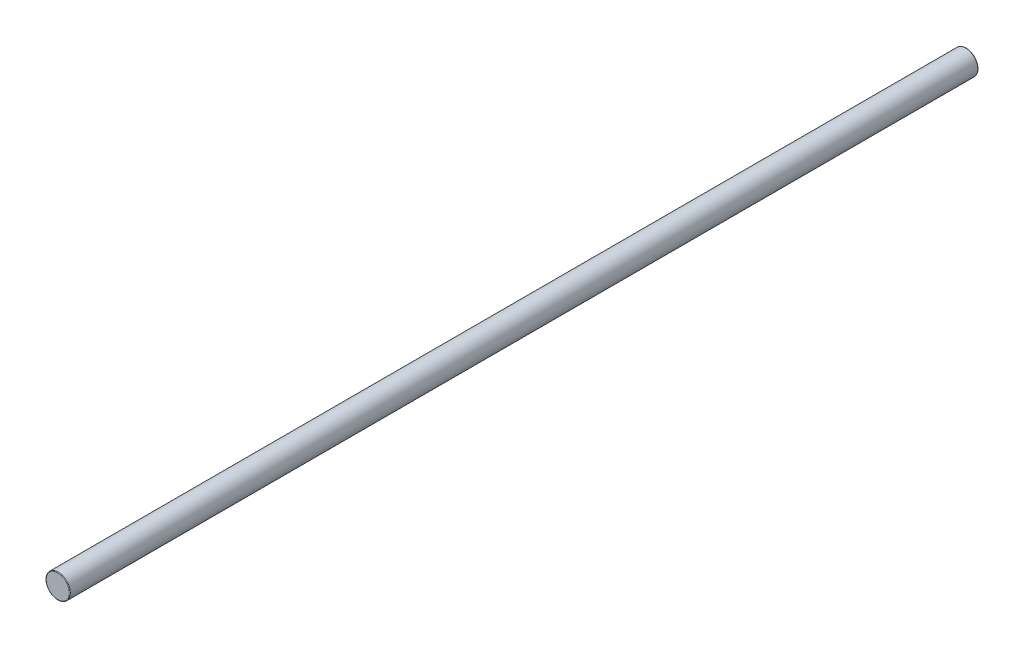
ISO-10303-21;
HEADER;
FILE_DESCRIPTION(('STEP AP214'),'2;1');
FILE_NAME('part.step','',(''),(''),'','','');
FILE_SCHEMA(('AUTOMOTIVE_DESIGN { 1 0 10303 214 1 1 1 1 }'));
ENDSEC;
DATA;
#1=APPLICATION_CONTEXT('core data for automotive mechanical design processes');
#2=APPLICATION_PROTOCOL_DEFINITION('international standard','automotive_design',2000,#1);
#3=PRODUCT_CONTEXT('',#1,'mechanical');
#4=PRODUCT('Part','Part','',(#3));
#5=PRODUCT_RELATED_PRODUCT_CATEGORY('part','',(#4));
#6=PRODUCT_DEFINITION_FORMATION('','',#4);
#7=PRODUCT_DEFINITION_CONTEXT('part definition',#1,'design');
#8=PRODUCT_DEFINITION('design','',#6,#7);
#9=PRODUCT_DEFINITION_SHAPE('','',#8);
#10=(LENGTH_UNIT() NAMED_UNIT(*) SI_UNIT(.MILLI.,.METRE.));
#11=(NAMED_UNIT(*) PLANE_ANGLE_UNIT() SI_UNIT($,.RADIAN.));
#12=(NAMED_UNIT(*) SI_UNIT($,.STERADIAN.) SOLID_ANGLE_UNIT());
#13=UNCERTAINTY_MEASURE_WITH_UNIT(LENGTH_MEASURE(1.E-05),#10,'distance_accuracy_value','');
#14=(GEOMETRIC_REPRESENTATION_CONTEXT(3) GLOBAL_UNCERTAINTY_ASSIGNED_CONTEXT((#13)) GLOBAL_UNIT_ASSIGNED_CONTEXT((#10,
#11,#12)) REPRESENTATION_CONTEXT('',''));
#15=CARTESIAN_POINT('',(0.,0.,0.));
#16=DIRECTION('',(0.,0.,1.));
#17=DIRECTION('',(1.,0.,0.));
#18=AXIS2_PLACEMENT_3D('',#15,#16,#17);
#19=CARTESIAN_POINT('',(0.,0.,-300.));
#20=DIRECTION('',(0.,0.,1.));
#21=DIRECTION('',(1.,0.,0.));
#22=AXIS2_PLACEMENT_3D('',#19,#20,#21);
#23=CYLINDRICAL_SURFACE('',#22,4.);
#24=CARTESIAN_POINT('',(0.,0.,-299.8));
#25=DIRECTION('',(0.,0.,1.));
#26=DIRECTION('',(1.,0.,0.));
#27=AXIS2_PLACEMENT_3D('',#24,#25,#26);
#28=CIRCLE('',#27,4.);
#29=CARTESIAN_POINT('',(4.,0.,-299.8));
#30=VERTEX_POINT('',#29);
#31=EDGE_CURVE('E43',#30,#30,#28,.T.);
#32=ORIENTED_EDGE('',*,*,#31,.T.);
#33=EDGE_LOOP('',(#32));
#34=FACE_BOUND('',#33,.T.);
#35=CARTESIAN_POINT('',(0.,0.,-0.199999999999978));
#36=DIRECTION('',(0.,0.,1.));
#37=DIRECTION('',(1.,0.,0.));
#38=AXIS2_PLACEMENT_3D('',#35,#36,#37);
#39=CIRCLE('',#38,4.);
#40=CARTESIAN_POINT('',(4.,0.,-0.199999999999978));
#41=VERTEX_POINT('',#40);
#42=EDGE_CURVE('E47',#41,#41,#39,.F.);
#43=ORIENTED_EDGE('',*,*,#42,.T.);
#44=EDGE_LOOP('',(#43));
#45=FACE_BOUND('',#44,.T.);
#46=ADVANCED_FACE('F32',(#34,#45),#23,.T.);
#47=CARTESIAN_POINT('',(0.,0.,-300.));
#48=DIRECTION('',(0.,0.,1.));
#49=DIRECTION('',(1.,0.,0.));
#50=AXIS2_PLACEMENT_3D('',#47,#48,#49);
#51=PLANE('',#50);
#52=CARTESIAN_POINT('',(0.,0.,-300.));
#53=DIRECTION('',(0.,0.,1.));
#54=DIRECTION('',(1.,0.,0.));
#55=AXIS2_PLACEMENT_3D('',#52,#53,#54);
#56=CIRCLE('',#55,3.8);
#57=CARTESIAN_POINT('',(3.8,0.,-300.));
#58=VERTEX_POINT('',#57);
#59=EDGE_CURVE('E39',#58,#58,#56,.F.);
#60=ORIENTED_EDGE('',*,*,#59,.T.);
#61=EDGE_LOOP('',(#60));
#62=FACE_BOUND('',#61,.T.);
#63=ADVANCED_FACE('F63',(#62),#51,.F.);
#64=CARTESIAN_POINT('',(0.,0.,0.));
#65=DIRECTION('',(0.,0.,1.));
#66=DIRECTION('',(1.,0.,0.));
#67=AXIS2_PLACEMENT_3D('',#64,#65,#66);
#68=PLANE('',#67);
#69=CARTESIAN_POINT('',(0.,0.,0.));
#70=DIRECTION('',(0.,0.,1.));
#71=DIRECTION('',(1.,0.,0.));
#72=AXIS2_PLACEMENT_3D('',#69,#70,#71);
#73=CIRCLE('',#72,3.8);
#74=CARTESIAN_POINT('',(3.8,0.,0.));
#75=VERTEX_POINT('',#74);
#76=EDGE_CURVE('E10',#75,#75,#73,.T.);
#77=ORIENTED_EDGE('',*,*,#76,.T.);
#78=EDGE_LOOP('',(#77));
#79=FACE_BOUND('',#78,.T.);
#80=ADVANCED_FACE('F60',(#79),#68,.T.);
#81=CARTESIAN_POINT('',(0.,0.,-299.8));
#82=DIRECTION('',(0.,0.,1.));
#83=DIRECTION('',(1.,0.,0.));
#84=AXIS2_PLACEMENT_3D('',#81,#82,#83);
#85=TOROIDAL_SURFACE('',#84,3.8,0.2);
#86=ORIENTED_EDGE('',*,*,#59,.F.);
#87=EDGE_LOOP('',(#86));
#88=FACE_BOUND('',#87,.T.);
#89=ORIENTED_EDGE('',*,*,#31,.F.);
#90=EDGE_LOOP('',(#89));
#91=FACE_BOUND('',#90,.T.);
#92=ADVANCED_FACE('F56',(#88,#91),#85,.T.);
#93=CARTESIAN_POINT('',(0.,0.,-0.199999999999978));
#94=DIRECTION('',(0.,0.,1.));
#95=DIRECTION('',(1.,0.,0.));
#96=AXIS2_PLACEMENT_3D('',#93,#94,#95);
#97=TOROIDAL_SURFACE('',#96,3.8,0.2);
#98=ORIENTED_EDGE('',*,*,#42,.F.);
#99=EDGE_LOOP('',(#98));
#100=FACE_BOUND('',#99,.T.);
#101=ORIENTED_EDGE('',*,*,#76,.F.);
#102=EDGE_LOOP('',(#101));
#103=FACE_BOUND('',#102,.T.);
#104=ADVANCED_FACE('F34',(#100,#103),#97,.T.);
#105=CLOSED_SHELL('',(#46,#63,#80,#92,#104));
#106=MANIFOLD_SOLID_BREP('B2',#105);
#107=ADVANCED_BREP_SHAPE_REPRESENTATION('',(#18,#106),#14);
#108=SHAPE_DEFINITION_REPRESENTATION(#9,#107);
ENDSEC;
END-ISO-10303-21;
